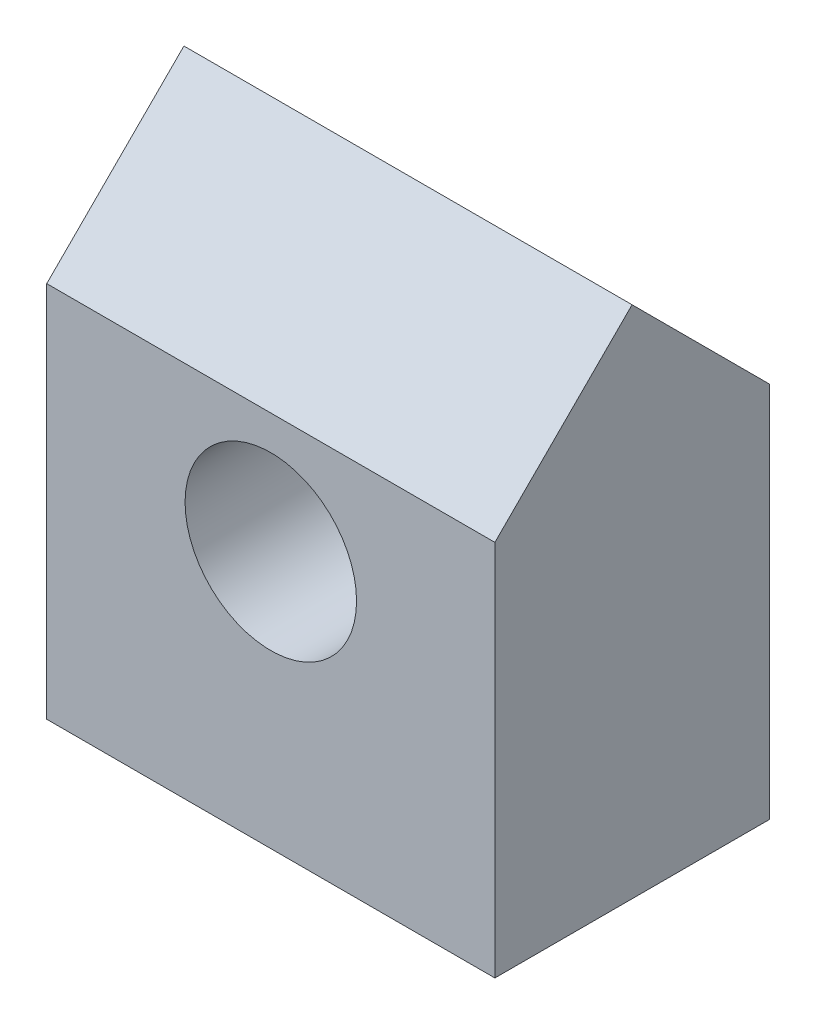
ISO-10303-21;
HEADER;
FILE_DESCRIPTION(('STEP AP214'),'2;1');
FILE_NAME('part.step','',(''),(''),'','','');
FILE_SCHEMA(('AUTOMOTIVE_DESIGN { 1 0 10303 214 1 1 1 1 }'));
ENDSEC;
DATA;
#1=APPLICATION_CONTEXT('core data for automotive mechanical design processes');
#2=APPLICATION_PROTOCOL_DEFINITION('international standard','automotive_design',2000,#1);
#3=PRODUCT_CONTEXT('',#1,'mechanical');
#4=PRODUCT('Part','Part','',(#3));
#5=PRODUCT_RELATED_PRODUCT_CATEGORY('part','',(#4));
#6=PRODUCT_DEFINITION_FORMATION('','',#4);
#7=PRODUCT_DEFINITION_CONTEXT('part definition',#1,'design');
#8=PRODUCT_DEFINITION('design','',#6,#7);
#9=PRODUCT_DEFINITION_SHAPE('','',#8);
#10=(LENGTH_UNIT() NAMED_UNIT(*) SI_UNIT(.MILLI.,.METRE.));
#11=(NAMED_UNIT(*) PLANE_ANGLE_UNIT() SI_UNIT($,.RADIAN.));
#12=(NAMED_UNIT(*) SI_UNIT($,.STERADIAN.) SOLID_ANGLE_UNIT());
#13=UNCERTAINTY_MEASURE_WITH_UNIT(LENGTH_MEASURE(1.E-05),#10,'distance_accuracy_value','');
#14=(GEOMETRIC_REPRESENTATION_CONTEXT(3) GLOBAL_UNCERTAINTY_ASSIGNED_CONTEXT((#13)) GLOBAL_UNIT_ASSIGNED_CONTEXT((#10,
#11,#12)) REPRESENTATION_CONTEXT('',''));
#15=CARTESIAN_POINT('',(0.,0.,0.));
#16=DIRECTION('',(0.,0.,1.));
#17=DIRECTION('',(1.,0.,0.));
#18=AXIS2_PLACEMENT_3D('',#15,#16,#17);
#19=CARTESIAN_POINT('',(0.,4.5,0.));
#20=DIRECTION('',(1.,0.,0.));
#21=DIRECTION('',(0.,0.,-1.));
#22=AXIS2_PLACEMENT_3D('',#19,#20,#21);
#23=PLANE('',#22);
#24=DIRECTION('',(0.,0.707106781186549,-0.707106781186546));
#25=VECTOR('',#24,1.);
#26=CARTESIAN_POINT('',(0.,4.5,1.2));
#27=LINE('',#26,#25);
#28=CARTESIAN_POINT('',(0.,3.3,2.4));
#29=VERTEX_POINT('',#28);
#30=CARTESIAN_POINT('',(0.,4.5,1.2));
#31=VERTEX_POINT('',#30);
#32=EDGE_CURVE('E91',#29,#31,#27,.T.);
#33=ORIENTED_EDGE('',*,*,#32,.T.);
#34=DIRECTION('',(0.,-0.707106781186549,-0.707106781186546));
#35=VECTOR('',#34,1.);
#36=CARTESIAN_POINT('',(0.,4.5,1.2));
#37=LINE('',#36,#35);
#38=CARTESIAN_POINT('',(0.,3.3,0.));
#39=VERTEX_POINT('',#38);
#40=EDGE_CURVE('E120',#31,#39,#37,.T.);
#41=ORIENTED_EDGE('',*,*,#40,.T.);
#42=DIRECTION('',(0.,-1.,0.));
#43=VECTOR('',#42,1.);
#44=CARTESIAN_POINT('',(0.,4.5,0.));
#45=LINE('',#44,#43);
#46=CARTESIAN_POINT('',(0.,0.,0.));
#47=VERTEX_POINT('',#46);
#48=EDGE_CURVE('E103',#39,#47,#45,.T.);
#49=ORIENTED_EDGE('',*,*,#48,.T.);
#50=DIRECTION('',(0.,0.,1.));
#51=VECTOR('',#50,1.);
#52=CARTESIAN_POINT('',(0.,0.,0.));
#53=LINE('',#52,#51);
#54=CARTESIAN_POINT('',(0.,0.,2.4));
#55=VERTEX_POINT('',#54);
#56=EDGE_CURVE('E98',#47,#55,#53,.T.);
#57=ORIENTED_EDGE('',*,*,#56,.T.);
#58=DIRECTION('',(0.,-1.,0.));
#59=VECTOR('',#58,1.);
#60=CARTESIAN_POINT('',(0.,4.5,2.4));
#61=LINE('',#60,#59);
#62=EDGE_CURVE('E82',#29,#55,#61,.T.);
#63=ORIENTED_EDGE('',*,*,#62,.F.);
#64=EDGE_LOOP('',(#33,#41,#49,#57,#63));
#65=FACE_BOUND('',#64,.T.);
#66=ADVANCED_FACE('F37',(#65),#23,.F.);
#67=CARTESIAN_POINT('',(0.,4.5,2.4));
#68=DIRECTION('',(0.,0.,-1.));
#69=DIRECTION('',(-1.,0.,0.));
#70=AXIS2_PLACEMENT_3D('',#67,#68,#69);
#71=PLANE('',#70);
#72=CARTESIAN_POINT('',(1.96,2.25,2.4));
#73=DIRECTION('',(0.,0.,1.));
#74=DIRECTION('',(1.,0.,0.));
#75=AXIS2_PLACEMENT_3D('',#72,#73,#74);
#76=CIRCLE('',#75,0.75);
#77=CARTESIAN_POINT('',(2.71,2.25,2.4));
#78=VERTEX_POINT('',#77);
#79=EDGE_CURVE('E108',#78,#78,#76,.T.);
#80=ORIENTED_EDGE('',*,*,#79,.F.);
#81=EDGE_LOOP('',(#80));
#82=FACE_BOUND('',#81,.T.);
#83=DIRECTION('',(0.,-1.,0.));
#84=VECTOR('',#83,1.);
#85=CARTESIAN_POINT('',(3.92,4.5,2.4));
#86=LINE('',#85,#84);
#87=CARTESIAN_POINT('',(3.92,3.3,2.4));
#88=VERTEX_POINT('',#87);
#89=CARTESIAN_POINT('',(3.92,0.,2.4));
#90=VERTEX_POINT('',#89);
#91=EDGE_CURVE('E92',#88,#90,#86,.T.);
#92=ORIENTED_EDGE('',*,*,#91,.F.);
#93=DIRECTION('',(-1.,0.,0.));
#94=VECTOR('',#93,1.);
#95=CARTESIAN_POINT('',(0.,3.3,2.4));
#96=LINE('',#95,#94);
#97=EDGE_CURVE('E11',#88,#29,#96,.T.);
#98=ORIENTED_EDGE('',*,*,#97,.T.);
#99=ORIENTED_EDGE('',*,*,#62,.T.);
#100=DIRECTION('',(1.,0.,0.));
#101=VECTOR('',#100,1.);
#102=CARTESIAN_POINT('',(0.,0.,2.4));
#103=LINE('',#102,#101);
#104=EDGE_CURVE('E85',#55,#90,#103,.T.);
#105=ORIENTED_EDGE('',*,*,#104,.T.);
#106=EDGE_LOOP('',(#92,#98,#99,#105));
#107=FACE_BOUND('',#106,.T.);
#108=ADVANCED_FACE('F84',(#82,#107),#71,.F.);
#109=CARTESIAN_POINT('',(3.92,4.5,0.));
#110=DIRECTION('',(-1.,0.,0.));
#111=DIRECTION('',(0.,0.,1.));
#112=AXIS2_PLACEMENT_3D('',#109,#110,#111);
#113=PLANE('',#112);
#114=DIRECTION('',(0.,-1.,0.));
#115=VECTOR('',#114,1.);
#116=CARTESIAN_POINT('',(3.92,4.5,0.));
#117=LINE('',#116,#115);
#118=CARTESIAN_POINT('',(3.92,3.3,0.));
#119=VERTEX_POINT('',#118);
#120=CARTESIAN_POINT('',(3.92,0.,0.));
#121=VERTEX_POINT('',#120);
#122=EDGE_CURVE('E116',#119,#121,#117,.T.);
#123=ORIENTED_EDGE('',*,*,#122,.F.);
#124=DIRECTION('',(0.,0.707106781186549,0.707106781186546));
#125=VECTOR('',#124,1.);
#126=CARTESIAN_POINT('',(3.92,4.5,1.2));
#127=LINE('',#126,#125);
#128=CARTESIAN_POINT('',(3.92,4.5,1.2));
#129=VERTEX_POINT('',#128);
#130=EDGE_CURVE('E47',#119,#129,#127,.T.);
#131=ORIENTED_EDGE('',*,*,#130,.T.);
#132=DIRECTION('',(0.,-0.707106781186549,0.707106781186546));
#133=VECTOR('',#132,1.);
#134=CARTESIAN_POINT('',(3.92,4.5,1.2));
#135=LINE('',#134,#133);
#136=EDGE_CURVE('E54',#129,#88,#135,.T.);
#137=ORIENTED_EDGE('',*,*,#136,.T.);
#138=ORIENTED_EDGE('',*,*,#91,.T.);
#139=DIRECTION('',(0.,0.,-1.));
#140=VECTOR('',#139,1.);
#141=CARTESIAN_POINT('',(3.92,0.,0.));
#142=LINE('',#141,#140);
#143=EDGE_CURVE('E100',#90,#121,#142,.T.);
#144=ORIENTED_EDGE('',*,*,#143,.T.);
#145=EDGE_LOOP('',(#123,#131,#137,#138,#144));
#146=FACE_BOUND('',#145,.T.);
#147=ADVANCED_FACE('F131',(#146),#113,.F.);
#148=CARTESIAN_POINT('',(0.,4.5,0.));
#149=DIRECTION('',(0.,0.,1.));
#150=DIRECTION('',(1.,0.,0.));
#151=AXIS2_PLACEMENT_3D('',#148,#149,#150);
#152=PLANE('',#151);
#153=CARTESIAN_POINT('',(1.96,2.25,0.));
#154=DIRECTION('',(0.,0.,1.));
#155=DIRECTION('',(1.,0.,0.));
#156=AXIS2_PLACEMENT_3D('',#153,#154,#155);
#157=CIRCLE('',#156,0.75);
#158=CARTESIAN_POINT('',(2.71,2.25,0.));
#159=VERTEX_POINT('',#158);
#160=EDGE_CURVE('E105',#159,#159,#157,.T.);
#161=ORIENTED_EDGE('',*,*,#160,.T.);
#162=EDGE_LOOP('',(#161));
#163=FACE_BOUND('',#162,.T.);
#164=ORIENTED_EDGE('',*,*,#48,.F.);
#165=DIRECTION('',(1.,0.,0.));
#166=VECTOR('',#165,1.);
#167=CARTESIAN_POINT('',(3.92,3.3,0.));
#168=LINE('',#167,#166);
#169=EDGE_CURVE('E122',#39,#119,#168,.T.);
#170=ORIENTED_EDGE('',*,*,#169,.T.);
#171=ORIENTED_EDGE('',*,*,#122,.T.);
#172=DIRECTION('',(-1.,0.,0.));
#173=VECTOR('',#172,1.);
#174=CARTESIAN_POINT('',(0.,0.,0.));
#175=LINE('',#174,#173);
#176=EDGE_CURVE('E113',#121,#47,#175,.T.);
#177=ORIENTED_EDGE('',*,*,#176,.T.);
#178=EDGE_LOOP('',(#164,#170,#171,#177));
#179=FACE_BOUND('',#178,.T.);
#180=ADVANCED_FACE('F128',(#163,#179),#152,.F.);
#181=CARTESIAN_POINT('',(0.,0.,0.));
#182=DIRECTION('',(0.,1.,0.));
#183=DIRECTION('',(0.,0.,1.));
#184=AXIS2_PLACEMENT_3D('',#181,#182,#183);
#185=PLANE('',#184);
#186=ORIENTED_EDGE('',*,*,#56,.F.);
#187=ORIENTED_EDGE('',*,*,#176,.F.);
#188=ORIENTED_EDGE('',*,*,#143,.F.);
#189=ORIENTED_EDGE('',*,*,#104,.F.);
#190=EDGE_LOOP('',(#186,#187,#188,#189));
#191=FACE_BOUND('',#190,.T.);
#192=ADVANCED_FACE('F96',(#191),#185,.F.);
#193=CARTESIAN_POINT('',(1.96,2.25,-2.1));
#194=DIRECTION('',(0.,0.,1.));
#195=DIRECTION('',(1.,0.,0.));
#196=AXIS2_PLACEMENT_3D('',#193,#194,#195);
#197=CYLINDRICAL_SURFACE('',#196,0.75);
#198=ORIENTED_EDGE('',*,*,#79,.T.);
#199=EDGE_LOOP('',(#198));
#200=FACE_BOUND('',#199,.T.);
#201=ORIENTED_EDGE('',*,*,#160,.F.);
#202=EDGE_LOOP('',(#201));
#203=FACE_BOUND('',#202,.T.);
#204=ADVANCED_FACE('F139',(#200,#203),#197,.F.);
#205=CARTESIAN_POINT('',(0.,4.5,1.2));
#206=DIRECTION('',(0.,0.707106781186546,0.707106781186549));
#207=DIRECTION('',(-1.,0.,0.));
#208=AXIS2_PLACEMENT_3D('',#205,#206,#207);
#209=PLANE('',#208);
#210=ORIENTED_EDGE('',*,*,#97,.F.);
#211=ORIENTED_EDGE('',*,*,#136,.F.);
#212=DIRECTION('',(1.,0.,0.));
#213=VECTOR('',#212,1.);
#214=CARTESIAN_POINT('',(3.92,4.5,1.2));
#215=LINE('',#214,#213);
#216=EDGE_CURVE('E42',#31,#129,#215,.T.);
#217=ORIENTED_EDGE('',*,*,#216,.F.);
#218=ORIENTED_EDGE('',*,*,#32,.F.);
#219=EDGE_LOOP('',(#210,#211,#217,#218));
#220=FACE_BOUND('',#219,.T.);
#221=ADVANCED_FACE('F40',(#220),#209,.T.);
#222=CARTESIAN_POINT('',(0.,4.5,1.2));
#223=DIRECTION('',(0.,0.707106781186546,-0.707106781186549));
#224=DIRECTION('',(1.,0.,0.));
#225=AXIS2_PLACEMENT_3D('',#222,#223,#224);
#226=PLANE('',#225);
#227=ORIENTED_EDGE('',*,*,#130,.F.);
#228=ORIENTED_EDGE('',*,*,#169,.F.);
#229=ORIENTED_EDGE('',*,*,#40,.F.);
#230=ORIENTED_EDGE('',*,*,#216,.T.);
#231=EDGE_LOOP('',(#227,#228,#229,#230));
#232=FACE_BOUND('',#231,.T.);
#233=ADVANCED_FACE('F135',(#232),#226,.T.);
#234=CLOSED_SHELL('',(#66,#108,#147,#180,#192,#204,#221,#233));
#235=MANIFOLD_SOLID_BREP('B2',#234);
#236=ADVANCED_BREP_SHAPE_REPRESENTATION('',(#18,#235),#14);
#237=SHAPE_DEFINITION_REPRESENTATION(#9,#236);
ENDSEC;
END-ISO-10303-21;
